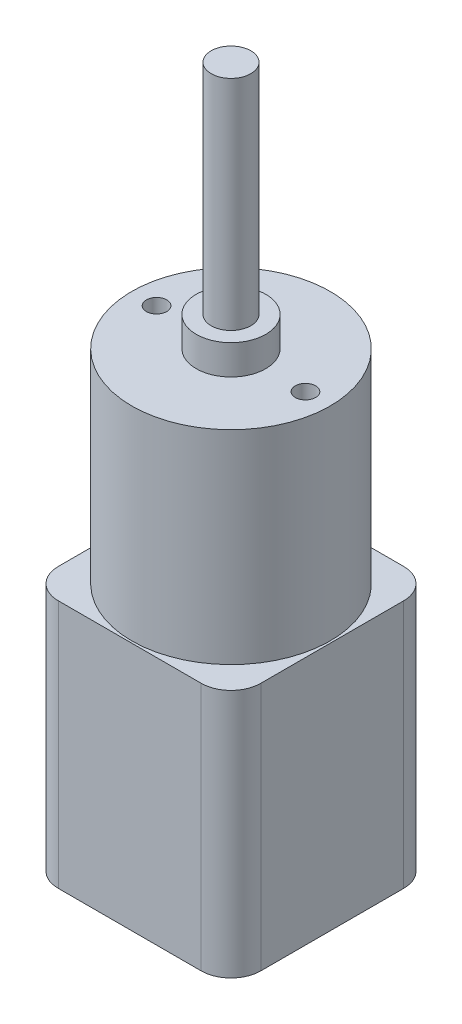
ISO-10303-21;
HEADER;
FILE_DESCRIPTION(('STEP AP214'),'2;1');
FILE_NAME('part.step','',(''),(''),'','','');
FILE_SCHEMA(('AUTOMOTIVE_DESIGN { 1 0 10303 214 1 1 1 1 }'));
ENDSEC;
DATA;
#1=APPLICATION_CONTEXT('core data for automotive mechanical design processes');
#2=APPLICATION_PROTOCOL_DEFINITION('international standard','automotive_design',2000,#1);
#3=PRODUCT_CONTEXT('',#1,'mechanical');
#4=PRODUCT('Part','Part','',(#3));
#5=PRODUCT_RELATED_PRODUCT_CATEGORY('part','',(#4));
#6=PRODUCT_DEFINITION_FORMATION('','',#4);
#7=PRODUCT_DEFINITION_CONTEXT('part definition',#1,'design');
#8=PRODUCT_DEFINITION('design','',#6,#7);
#9=PRODUCT_DEFINITION_SHAPE('','',#8);
#10=(LENGTH_UNIT() NAMED_UNIT(*) SI_UNIT(.MILLI.,.METRE.));
#11=(NAMED_UNIT(*) PLANE_ANGLE_UNIT() SI_UNIT($,.RADIAN.));
#12=(NAMED_UNIT(*) SI_UNIT($,.STERADIAN.) SOLID_ANGLE_UNIT());
#13=UNCERTAINTY_MEASURE_WITH_UNIT(LENGTH_MEASURE(1.E-05),#10,'distance_accuracy_value','');
#14=(GEOMETRIC_REPRESENTATION_CONTEXT(3) GLOBAL_UNCERTAINTY_ASSIGNED_CONTEXT((#13)) GLOBAL_UNIT_ASSIGNED_CONTEXT((#10,
#11,#12)) REPRESENTATION_CONTEXT('',''));
#15=CARTESIAN_POINT('',(0.,0.,0.));
#16=DIRECTION('',(0.,0.,1.));
#17=DIRECTION('',(1.,0.,0.));
#18=AXIS2_PLACEMENT_3D('',#15,#16,#17);
#19=CARTESIAN_POINT('',(10.2,25.1,10.2));
#20=DIRECTION('',(-1.,0.,0.));
#21=DIRECTION('',(0.,0.,1.));
#22=AXIS2_PLACEMENT_3D('',#19,#20,#21);
#23=PLANE('',#22);
#24=DIRECTION('',(0.,0.,-1.));
#25=VECTOR('',#24,1.);
#26=CARTESIAN_POINT('',(10.2,25.1,10.2));
#27=LINE('',#26,#25);
#28=CARTESIAN_POINT('',(10.2,25.1,7.2));
#29=VERTEX_POINT('',#28);
#30=CARTESIAN_POINT('',(10.2,25.1,-7.2));
#31=VERTEX_POINT('',#30);
#32=EDGE_CURVE('E152',#29,#31,#27,.T.);
#33=ORIENTED_EDGE('',*,*,#32,.F.);
#34=DIRECTION('',(0.,-1.,0.));
#35=VECTOR('',#34,1.);
#36=CARTESIAN_POINT('',(10.2,25.1,7.2));
#37=LINE('',#36,#35);
#38=CARTESIAN_POINT('',(10.2,0.,7.2));
#39=VERTEX_POINT('',#38);
#40=EDGE_CURVE('E172',#29,#39,#37,.T.);
#41=ORIENTED_EDGE('',*,*,#40,.T.);
#42=DIRECTION('',(0.,0.,-1.));
#43=VECTOR('',#42,1.);
#44=CARTESIAN_POINT('',(10.2,0.,10.2));
#45=LINE('',#44,#43);
#46=CARTESIAN_POINT('',(10.2,0.,-7.2));
#47=VERTEX_POINT('',#46);
#48=EDGE_CURVE('E148',#39,#47,#45,.T.);
#49=ORIENTED_EDGE('',*,*,#48,.T.);
#50=DIRECTION('',(0.,-1.,0.));
#51=VECTOR('',#50,1.);
#52=CARTESIAN_POINT('',(10.2,25.1,-7.2));
#53=LINE('',#52,#51);
#54=EDGE_CURVE('E138',#47,#31,#53,.F.);
#55=ORIENTED_EDGE('',*,*,#54,.T.);
#56=EDGE_LOOP('',(#33,#41,#49,#55));
#57=FACE_BOUND('',#56,.T.);
#58=ADVANCED_FACE('F40',(#57),#23,.F.);
#59=CARTESIAN_POINT('',(-10.2,25.1,-10.2));
#60=DIRECTION('',(0.,0.,1.));
#61=DIRECTION('',(1.,0.,0.));
#62=AXIS2_PLACEMENT_3D('',#59,#60,#61);
#63=PLANE('',#62);
#64=DIRECTION('',(-1.,0.,0.));
#65=VECTOR('',#64,1.);
#66=CARTESIAN_POINT('',(-10.2,0.,-10.2));
#67=LINE('',#66,#65);
#68=CARTESIAN_POINT('',(7.2,0.,-10.2));
#69=VERTEX_POINT('',#68);
#70=CARTESIAN_POINT('',(-7.2,0.,-10.2));
#71=VERTEX_POINT('',#70);
#72=EDGE_CURVE('E164',#69,#71,#67,.T.);
#73=ORIENTED_EDGE('',*,*,#72,.T.);
#74=DIRECTION('',(0.,-1.,0.));
#75=VECTOR('',#74,1.);
#76=CARTESIAN_POINT('',(-7.2,25.1,-10.2));
#77=LINE('',#76,#75);
#78=CARTESIAN_POINT('',(-7.2,25.1,-10.2));
#79=VERTEX_POINT('',#78);
#80=EDGE_CURVE('E11',#71,#79,#77,.F.);
#81=ORIENTED_EDGE('',*,*,#80,.T.);
#82=DIRECTION('',(-1.,0.,0.));
#83=VECTOR('',#82,1.);
#84=CARTESIAN_POINT('',(-10.2,25.1,-10.2));
#85=LINE('',#84,#83);
#86=CARTESIAN_POINT('',(7.2,25.1,-10.2));
#87=VERTEX_POINT('',#86);
#88=EDGE_CURVE('E155',#87,#79,#85,.T.);
#89=ORIENTED_EDGE('',*,*,#88,.F.);
#90=DIRECTION('',(0.,-1.,0.));
#91=VECTOR('',#90,1.);
#92=CARTESIAN_POINT('',(7.2,25.1,-10.2));
#93=LINE('',#92,#91);
#94=EDGE_CURVE('E48',#87,#69,#93,.T.);
#95=ORIENTED_EDGE('',*,*,#94,.T.);
#96=EDGE_LOOP('',(#73,#81,#89,#95));
#97=FACE_BOUND('',#96,.T.);
#98=ADVANCED_FACE('F203',(#97),#63,.F.);
#99=CARTESIAN_POINT('',(-10.2,25.1,10.2));
#100=DIRECTION('',(1.,0.,0.));
#101=DIRECTION('',(0.,0.,-1.));
#102=AXIS2_PLACEMENT_3D('',#99,#100,#101);
#103=PLANE('',#102);
#104=DIRECTION('',(0.,0.,1.));
#105=VECTOR('',#104,1.);
#106=CARTESIAN_POINT('',(-10.2,0.,10.2));
#107=LINE('',#106,#105);
#108=CARTESIAN_POINT('',(-10.2,0.,-7.2));
#109=VERTEX_POINT('',#108);
#110=CARTESIAN_POINT('',(-10.2,0.,7.2));
#111=VERTEX_POINT('',#110);
#112=EDGE_CURVE('E167',#109,#111,#107,.T.);
#113=ORIENTED_EDGE('',*,*,#112,.T.);
#114=DIRECTION('',(0.,-1.,0.));
#115=VECTOR('',#114,1.);
#116=CARTESIAN_POINT('',(-10.2,25.1,7.2));
#117=LINE('',#116,#115);
#118=CARTESIAN_POINT('',(-10.2,25.1,7.2));
#119=VERTEX_POINT('',#118);
#120=EDGE_CURVE('E55',#111,#119,#117,.F.);
#121=ORIENTED_EDGE('',*,*,#120,.T.);
#122=DIRECTION('',(0.,0.,1.));
#123=VECTOR('',#122,1.);
#124=CARTESIAN_POINT('',(-10.2,25.1,10.2));
#125=LINE('',#124,#123);
#126=CARTESIAN_POINT('',(-10.2,25.1,-7.2));
#127=VERTEX_POINT('',#126);
#128=EDGE_CURVE('E158',#127,#119,#125,.T.);
#129=ORIENTED_EDGE('',*,*,#128,.F.);
#130=DIRECTION('',(0.,-1.,0.));
#131=VECTOR('',#130,1.);
#132=CARTESIAN_POINT('',(-10.2,25.1,-7.2));
#133=LINE('',#132,#131);
#134=EDGE_CURVE('E195',#127,#109,#133,.T.);
#135=ORIENTED_EDGE('',*,*,#134,.T.);
#136=EDGE_LOOP('',(#113,#121,#129,#135));
#137=FACE_BOUND('',#136,.T.);
#138=ADVANCED_FACE('F214',(#137),#103,.F.);
#139=CARTESIAN_POINT('',(-10.2,25.1,10.2));
#140=DIRECTION('',(0.,0.,-1.));
#141=DIRECTION('',(-1.,0.,0.));
#142=AXIS2_PLACEMENT_3D('',#139,#140,#141);
#143=PLANE('',#142);
#144=DIRECTION('',(1.,0.,0.));
#145=VECTOR('',#144,1.);
#146=CARTESIAN_POINT('',(-10.2,0.,10.2));
#147=LINE('',#146,#145);
#148=CARTESIAN_POINT('',(-7.2,0.,10.2));
#149=VERTEX_POINT('',#148);
#150=CARTESIAN_POINT('',(7.2,0.,10.2));
#151=VERTEX_POINT('',#150);
#152=EDGE_CURVE('E156',#149,#151,#147,.T.);
#153=ORIENTED_EDGE('',*,*,#152,.T.);
#154=DIRECTION('',(0.,-1.,0.));
#155=VECTOR('',#154,1.);
#156=CARTESIAN_POINT('',(7.2,25.1,10.2));
#157=LINE('',#156,#155);
#158=CARTESIAN_POINT('',(7.2,25.1,10.2));
#159=VERTEX_POINT('',#158);
#160=EDGE_CURVE('E186',#151,#159,#157,.F.);
#161=ORIENTED_EDGE('',*,*,#160,.T.);
#162=DIRECTION('',(1.,0.,0.));
#163=VECTOR('',#162,1.);
#164=CARTESIAN_POINT('',(-10.2,25.1,10.2));
#165=LINE('',#164,#163);
#166=CARTESIAN_POINT('',(-7.2,25.1,10.2));
#167=VERTEX_POINT('',#166);
#168=EDGE_CURVE('E151',#167,#159,#165,.T.);
#169=ORIENTED_EDGE('',*,*,#168,.F.);
#170=DIRECTION('',(0.,-1.,0.));
#171=VECTOR('',#170,1.);
#172=CARTESIAN_POINT('',(-7.2,25.1,10.2));
#173=LINE('',#172,#171);
#174=EDGE_CURVE('E183',#167,#149,#173,.T.);
#175=ORIENTED_EDGE('',*,*,#174,.T.);
#176=EDGE_LOOP('',(#153,#161,#169,#175));
#177=FACE_BOUND('',#176,.T.);
#178=ADVANCED_FACE('F223',(#177),#143,.F.);
#179=CARTESIAN_POINT('',(0.,25.1,0.));
#180=DIRECTION('',(0.,-1.,0.));
#181=DIRECTION('',(0.,0.,-1.));
#182=AXIS2_PLACEMENT_3D('',#179,#180,#181);
#183=PLANE('',#182);
#184=CARTESIAN_POINT('',(0.,25.1,0.));
#185=DIRECTION('',(0.,1.,0.));
#186=DIRECTION('',(0.,0.,1.));
#187=AXIS2_PLACEMENT_3D('',#184,#185,#186);
#188=CIRCLE('',#187,10.);
#189=CARTESIAN_POINT('',(0.,25.1,10.));
#190=VERTEX_POINT('',#189);
#191=EDGE_CURVE('E145',#190,#190,#188,.T.);
#192=ORIENTED_EDGE('',*,*,#191,.F.);
#193=EDGE_LOOP('',(#192));
#194=FACE_BOUND('',#193,.T.);
#195=ORIENTED_EDGE('',*,*,#168,.T.);
#196=CARTESIAN_POINT('',(7.2,25.1,7.2));
#197=DIRECTION('',(0.,-1.,0.));
#198=DIRECTION('',(0.,0.,-1.));
#199=AXIS2_PLACEMENT_3D('',#196,#197,#198);
#200=CIRCLE('',#199,3.);
#201=EDGE_CURVE('E193',#159,#29,#200,.F.);
#202=ORIENTED_EDGE('',*,*,#201,.T.);
#203=ORIENTED_EDGE('',*,*,#32,.T.);
#204=CARTESIAN_POINT('',(7.2,25.1,-7.2));
#205=DIRECTION('',(0.,-1.,0.));
#206=DIRECTION('',(0.,0.,-1.));
#207=AXIS2_PLACEMENT_3D('',#204,#205,#206);
#208=CIRCLE('',#207,3.);
#209=EDGE_CURVE('E188',#31,#87,#208,.F.);
#210=ORIENTED_EDGE('',*,*,#209,.T.);
#211=ORIENTED_EDGE('',*,*,#88,.T.);
#212=CARTESIAN_POINT('',(-7.2,25.1,-7.2));
#213=DIRECTION('',(0.,-1.,0.));
#214=DIRECTION('',(0.,0.,-1.));
#215=AXIS2_PLACEMENT_3D('',#212,#213,#214);
#216=CIRCLE('',#215,3.);
#217=EDGE_CURVE('E62',#79,#127,#216,.F.);
#218=ORIENTED_EDGE('',*,*,#217,.T.);
#219=ORIENTED_EDGE('',*,*,#128,.T.);
#220=CARTESIAN_POINT('',(-7.2,25.1,7.2));
#221=DIRECTION('',(0.,-1.,0.));
#222=DIRECTION('',(0.,0.,-1.));
#223=AXIS2_PLACEMENT_3D('',#220,#221,#222);
#224=CIRCLE('',#223,3.);
#225=EDGE_CURVE('E191',#119,#167,#224,.F.);
#226=ORIENTED_EDGE('',*,*,#225,.T.);
#227=EDGE_LOOP('',(#195,#202,#203,#210,#211,#218,#219,#226));
#228=FACE_BOUND('',#227,.T.);
#229=ADVANCED_FACE('F216',(#194,#228),#183,.F.);
#230=CARTESIAN_POINT('',(0.,0.,0.));
#231=DIRECTION('',(0.,-1.,0.));
#232=DIRECTION('',(0.,0.,-1.));
#233=AXIS2_PLACEMENT_3D('',#230,#231,#232);
#234=PLANE('',#233);
#235=ORIENTED_EDGE('',*,*,#48,.F.);
#236=CARTESIAN_POINT('',(7.2,0.,7.2));
#237=DIRECTION('',(0.,-1.,0.));
#238=DIRECTION('',(0.,0.,-1.));
#239=AXIS2_PLACEMENT_3D('',#236,#237,#238);
#240=CIRCLE('',#239,3.);
#241=EDGE_CURVE('E181',#39,#151,#240,.T.);
#242=ORIENTED_EDGE('',*,*,#241,.T.);
#243=ORIENTED_EDGE('',*,*,#152,.F.);
#244=CARTESIAN_POINT('',(-7.2,0.,7.2));
#245=DIRECTION('',(0.,-1.,0.));
#246=DIRECTION('',(0.,0.,-1.));
#247=AXIS2_PLACEMENT_3D('',#244,#245,#246);
#248=CIRCLE('',#247,3.);
#249=EDGE_CURVE('E179',#149,#111,#248,.T.);
#250=ORIENTED_EDGE('',*,*,#249,.T.);
#251=ORIENTED_EDGE('',*,*,#112,.F.);
#252=CARTESIAN_POINT('',(-7.2,0.,-7.2));
#253=DIRECTION('',(0.,-1.,0.));
#254=DIRECTION('',(0.,0.,-1.));
#255=AXIS2_PLACEMENT_3D('',#252,#253,#254);
#256=CIRCLE('',#255,3.);
#257=EDGE_CURVE('E177',#109,#71,#256,.T.);
#258=ORIENTED_EDGE('',*,*,#257,.T.);
#259=ORIENTED_EDGE('',*,*,#72,.F.);
#260=CARTESIAN_POINT('',(7.2,0.,-7.2));
#261=DIRECTION('',(0.,-1.,0.));
#262=DIRECTION('',(0.,0.,-1.));
#263=AXIS2_PLACEMENT_3D('',#260,#261,#262);
#264=CIRCLE('',#263,3.);
#265=EDGE_CURVE('E175',#69,#47,#264,.T.);
#266=ORIENTED_EDGE('',*,*,#265,.T.);
#267=EDGE_LOOP('',(#235,#242,#243,#250,#251,#258,#259,#266));
#268=FACE_BOUND('',#267,.T.);
#269=ADVANCED_FACE('F209',(#268),#234,.T.);
#270=CARTESIAN_POINT('',(0.,45.6,0.));
#271=DIRECTION('',(0.,-1.,0.));
#272=DIRECTION('',(0.,0.,-1.));
#273=AXIS2_PLACEMENT_3D('',#270,#271,#272);
#274=CYLINDRICAL_SURFACE('',#273,10.);
#275=CARTESIAN_POINT('',(0.,45.6,0.));
#276=DIRECTION('',(0.,1.,0.));
#277=DIRECTION('',(0.,0.,1.));
#278=AXIS2_PLACEMENT_3D('',#275,#276,#277);
#279=CIRCLE('',#278,10.);
#280=CARTESIAN_POINT('',(0.,45.6,10.));
#281=VERTEX_POINT('',#280);
#282=EDGE_CURVE('E142',#281,#281,#279,.T.);
#283=ORIENTED_EDGE('',*,*,#282,.F.);
#284=EDGE_LOOP('',(#283));
#285=FACE_BOUND('',#284,.T.);
#286=ORIENTED_EDGE('',*,*,#191,.T.);
#287=EDGE_LOOP('',(#286));
#288=FACE_BOUND('',#287,.T.);
#289=ADVANCED_FACE('F346',(#285,#288),#274,.T.);
#290=CARTESIAN_POINT('',(0.,45.6,0.));
#291=DIRECTION('',(0.,1.,0.));
#292=DIRECTION('',(0.,0.,1.));
#293=AXIS2_PLACEMENT_3D('',#290,#291,#292);
#294=PLANE('',#293);
#295=CARTESIAN_POINT('',(-7.5,45.6,0.));
#296=DIRECTION('',(0.,1.,0.));
#297=DIRECTION('',(0.,0.,1.));
#298=AXIS2_PLACEMENT_3D('',#295,#296,#297);
#299=CIRCLE('',#298,1.025);
#300=CARTESIAN_POINT('',(-7.5,45.6,1.025));
#301=VERTEX_POINT('',#300);
#302=EDGE_CURVE('E121',#301,#301,#299,.T.);
#303=ORIENTED_EDGE('',*,*,#302,.F.);
#304=EDGE_LOOP('',(#303));
#305=FACE_BOUND('',#304,.T.);
#306=CARTESIAN_POINT('',(7.5,45.6,0.));
#307=DIRECTION('',(0.,1.,0.));
#308=DIRECTION('',(0.,0.,1.));
#309=AXIS2_PLACEMENT_3D('',#306,#307,#308);
#310=CIRCLE('',#309,1.025);
#311=CARTESIAN_POINT('',(7.5,45.6,1.025));
#312=VERTEX_POINT('',#311);
#313=EDGE_CURVE('E120',#312,#312,#310,.T.);
#314=ORIENTED_EDGE('',*,*,#313,.F.);
#315=EDGE_LOOP('',(#314));
#316=FACE_BOUND('',#315,.T.);
#317=CARTESIAN_POINT('',(0.,45.6,0.));
#318=DIRECTION('',(0.,1.,0.));
#319=DIRECTION('',(0.,0.,1.));
#320=AXIS2_PLACEMENT_3D('',#317,#318,#319);
#321=CIRCLE('',#320,3.5);
#322=CARTESIAN_POINT('',(0.,45.6,3.5));
#323=VERTEX_POINT('',#322);
#324=EDGE_CURVE('E139',#323,#323,#321,.T.);
#325=ORIENTED_EDGE('',*,*,#324,.F.);
#326=EDGE_LOOP('',(#325));
#327=FACE_BOUND('',#326,.T.);
#328=ORIENTED_EDGE('',*,*,#282,.T.);
#329=EDGE_LOOP('',(#328));
#330=FACE_BOUND('',#329,.T.);
#331=ADVANCED_FACE('F336',(#305,#316,#327,#330),#294,.T.);
#332=CARTESIAN_POINT('',(0.,48.6,0.));
#333=DIRECTION('',(0.,-1.,0.));
#334=DIRECTION('',(0.,0.,-1.));
#335=AXIS2_PLACEMENT_3D('',#332,#333,#334);
#336=CYLINDRICAL_SURFACE('',#335,3.5);
#337=CARTESIAN_POINT('',(0.,48.6,0.));
#338=DIRECTION('',(0.,1.,0.));
#339=DIRECTION('',(0.,0.,1.));
#340=AXIS2_PLACEMENT_3D('',#337,#338,#339);
#341=CIRCLE('',#340,3.5);
#342=CARTESIAN_POINT('',(0.,48.6,3.5));
#343=VERTEX_POINT('',#342);
#344=EDGE_CURVE('E134',#343,#343,#341,.T.);
#345=ORIENTED_EDGE('',*,*,#344,.F.);
#346=EDGE_LOOP('',(#345));
#347=FACE_BOUND('',#346,.T.);
#348=ORIENTED_EDGE('',*,*,#324,.T.);
#349=EDGE_LOOP('',(#348));
#350=FACE_BOUND('',#349,.T.);
#351=ADVANCED_FACE('F327',(#347,#350),#336,.T.);
#352=CARTESIAN_POINT('',(0.,48.6,0.));
#353=DIRECTION('',(0.,1.,0.));
#354=DIRECTION('',(0.,0.,1.));
#355=AXIS2_PLACEMENT_3D('',#352,#353,#354);
#356=PLANE('',#355);
#357=CARTESIAN_POINT('',(0.,48.6,0.));
#358=DIRECTION('',(0.,1.,0.));
#359=DIRECTION('',(0.,0.,1.));
#360=AXIS2_PLACEMENT_3D('',#357,#358,#359);
#361=CIRCLE('',#360,2.);
#362=CARTESIAN_POINT('',(0.,48.6,2.));
#363=VERTEX_POINT('',#362);
#364=EDGE_CURVE('E135',#363,#363,#361,.T.);
#365=ORIENTED_EDGE('',*,*,#364,.F.);
#366=EDGE_LOOP('',(#365));
#367=FACE_BOUND('',#366,.T.);
#368=ORIENTED_EDGE('',*,*,#344,.T.);
#369=EDGE_LOOP('',(#368));
#370=FACE_BOUND('',#369,.T.);
#371=ADVANCED_FACE('F318',(#367,#370),#356,.T.);
#372=CARTESIAN_POINT('',(0.,70.6,0.));
#373=DIRECTION('',(0.,-1.,0.));
#374=DIRECTION('',(0.,0.,-1.));
#375=AXIS2_PLACEMENT_3D('',#372,#373,#374);
#376=CYLINDRICAL_SURFACE('',#375,2.);
#377=CARTESIAN_POINT('',(0.,70.6,0.));
#378=DIRECTION('',(0.,1.,0.));
#379=DIRECTION('',(0.,0.,1.));
#380=AXIS2_PLACEMENT_3D('',#377,#378,#379);
#381=CIRCLE('',#380,2.);
#382=CARTESIAN_POINT('',(0.,70.6,2.));
#383=VERTEX_POINT('',#382);
#384=EDGE_CURVE('E131',#383,#383,#381,.T.);
#385=ORIENTED_EDGE('',*,*,#384,.F.);
#386=EDGE_LOOP('',(#385));
#387=FACE_BOUND('',#386,.T.);
#388=ORIENTED_EDGE('',*,*,#364,.T.);
#389=EDGE_LOOP('',(#388));
#390=FACE_BOUND('',#389,.T.);
#391=ADVANCED_FACE('F309',(#387,#390),#376,.T.);
#392=CARTESIAN_POINT('',(0.,70.6,0.));
#393=DIRECTION('',(0.,1.,0.));
#394=DIRECTION('',(0.,0.,1.));
#395=AXIS2_PLACEMENT_3D('',#392,#393,#394);
#396=PLANE('',#395);
#397=ORIENTED_EDGE('',*,*,#384,.T.);
#398=EDGE_LOOP('',(#397));
#399=FACE_BOUND('',#398,.T.);
#400=ADVANCED_FACE('F299',(#399),#396,.T.);
#401=CARTESIAN_POINT('',(7.5,40.6,0.));
#402=DIRECTION('',(0.,1.,0.));
#403=DIRECTION('',(0.,0.,1.));
#404=AXIS2_PLACEMENT_3D('',#401,#402,#403);
#405=CONICAL_SURFACE('',#404,1.025,1.02974425867665);
#406=CARTESIAN_POINT('',(7.5,39.9841178654967,0.));
#407=VERTEX_POINT('',#406);
#408=VERTEX_LOOP('',#407);
#409=FACE_BOUND('',#408,.T.);
#410=CARTESIAN_POINT('',(7.5,40.6,0.));
#411=DIRECTION('',(0.,1.,0.));
#412=DIRECTION('',(0.,0.,1.));
#413=AXIS2_PLACEMENT_3D('',#410,#411,#412);
#414=CIRCLE('',#413,1.025);
#415=CARTESIAN_POINT('',(7.5,40.6,1.025));
#416=VERTEX_POINT('',#415);
#417=EDGE_CURVE('E124',#416,#416,#414,.T.);
#418=ORIENTED_EDGE('',*,*,#417,.T.);
#419=EDGE_LOOP('',(#418));
#420=FACE_BOUND('',#419,.T.);
#421=ADVANCED_FACE('F289',(#409,#420),#405,.F.);
#422=CARTESIAN_POINT('',(7.5,45.6,0.));
#423=DIRECTION('',(0.,1.,0.));
#424=DIRECTION('',(0.,0.,1.));
#425=AXIS2_PLACEMENT_3D('',#422,#423,#424);
#426=CYLINDRICAL_SURFACE('',#425,1.025);
#427=ORIENTED_EDGE('',*,*,#417,.F.);
#428=EDGE_LOOP('',(#427));
#429=FACE_BOUND('',#428,.T.);
#430=ORIENTED_EDGE('',*,*,#313,.T.);
#431=EDGE_LOOP('',(#430));
#432=FACE_BOUND('',#431,.T.);
#433=ADVANCED_FACE('F114',(#429,#432),#426,.F.);
#434=CARTESIAN_POINT('',(-7.5,40.6,0.));
#435=DIRECTION('',(0.,1.,0.));
#436=DIRECTION('',(0.,0.,1.));
#437=AXIS2_PLACEMENT_3D('',#434,#435,#436);
#438=CONICAL_SURFACE('',#437,1.025,1.02974425867665);
#439=CARTESIAN_POINT('',(-7.5,39.9841178654967,0.));
#440=VERTEX_POINT('',#439);
#441=VERTEX_LOOP('',#440);
#442=FACE_BOUND('',#441,.T.);
#443=CARTESIAN_POINT('',(-7.5,40.6,0.));
#444=DIRECTION('',(0.,1.,0.));
#445=DIRECTION('',(0.,0.,1.));
#446=AXIS2_PLACEMENT_3D('',#443,#444,#445);
#447=CIRCLE('',#446,1.025);
#448=CARTESIAN_POINT('',(-7.5,40.6,1.025));
#449=VERTEX_POINT('',#448);
#450=EDGE_CURVE('E118',#449,#449,#447,.T.);
#451=ORIENTED_EDGE('',*,*,#450,.T.);
#452=EDGE_LOOP('',(#451));
#453=FACE_BOUND('',#452,.T.);
#454=ADVANCED_FACE('F110',(#442,#453),#438,.F.);
#455=CARTESIAN_POINT('',(-7.5,45.6,0.));
#456=DIRECTION('',(0.,1.,0.));
#457=DIRECTION('',(0.,0.,1.));
#458=AXIS2_PLACEMENT_3D('',#455,#456,#457);
#459=CYLINDRICAL_SURFACE('',#458,1.025);
#460=ORIENTED_EDGE('',*,*,#450,.F.);
#461=EDGE_LOOP('',(#460));
#462=FACE_BOUND('',#461,.T.);
#463=ORIENTED_EDGE('',*,*,#302,.T.);
#464=EDGE_LOOP('',(#463));
#465=FACE_BOUND('',#464,.T.);
#466=ADVANCED_FACE('F113',(#462,#465),#459,.F.);
#467=CARTESIAN_POINT('',(7.2,25.1,7.2));
#468=DIRECTION('',(0.,-1.,0.));
#469=DIRECTION('',(0.,0.,-1.));
#470=AXIS2_PLACEMENT_3D('',#467,#468,#469);
#471=CYLINDRICAL_SURFACE('',#470,3.);
#472=ORIENTED_EDGE('',*,*,#201,.F.);
#473=ORIENTED_EDGE('',*,*,#160,.F.);
#474=ORIENTED_EDGE('',*,*,#241,.F.);
#475=ORIENTED_EDGE('',*,*,#40,.F.);
#476=EDGE_LOOP('',(#472,#473,#474,#475));
#477=FACE_BOUND('',#476,.T.);
#478=ADVANCED_FACE('F228',(#477),#471,.T.);
#479=CARTESIAN_POINT('',(-7.2,25.1,7.2));
#480=DIRECTION('',(0.,-1.,0.));
#481=DIRECTION('',(0.,0.,-1.));
#482=AXIS2_PLACEMENT_3D('',#479,#480,#481);
#483=CYLINDRICAL_SURFACE('',#482,3.);
#484=ORIENTED_EDGE('',*,*,#225,.F.);
#485=ORIENTED_EDGE('',*,*,#120,.F.);
#486=ORIENTED_EDGE('',*,*,#249,.F.);
#487=ORIENTED_EDGE('',*,*,#174,.F.);
#488=EDGE_LOOP('',(#484,#485,#486,#487));
#489=FACE_BOUND('',#488,.T.);
#490=ADVANCED_FACE('F220',(#489),#483,.T.);
#491=CARTESIAN_POINT('',(-7.2,25.1,-7.2));
#492=DIRECTION('',(0.,-1.,0.));
#493=DIRECTION('',(0.,0.,-1.));
#494=AXIS2_PLACEMENT_3D('',#491,#492,#493);
#495=CYLINDRICAL_SURFACE('',#494,3.);
#496=ORIENTED_EDGE('',*,*,#217,.F.);
#497=ORIENTED_EDGE('',*,*,#80,.F.);
#498=ORIENTED_EDGE('',*,*,#257,.F.);
#499=ORIENTED_EDGE('',*,*,#134,.F.);
#500=EDGE_LOOP('',(#496,#497,#498,#499));
#501=FACE_BOUND('',#500,.T.);
#502=ADVANCED_FACE('F213',(#501),#495,.T.);
#503=CARTESIAN_POINT('',(7.2,25.1,-7.2));
#504=DIRECTION('',(0.,-1.,0.));
#505=DIRECTION('',(0.,0.,-1.));
#506=AXIS2_PLACEMENT_3D('',#503,#504,#505);
#507=CYLINDRICAL_SURFACE('',#506,3.);
#508=ORIENTED_EDGE('',*,*,#209,.F.);
#509=ORIENTED_EDGE('',*,*,#54,.F.);
#510=ORIENTED_EDGE('',*,*,#265,.F.);
#511=ORIENTED_EDGE('',*,*,#94,.F.);
#512=EDGE_LOOP('',(#508,#509,#510,#511));
#513=FACE_BOUND('',#512,.T.);
#514=ADVANCED_FACE('F42',(#513),#507,.T.);
#515=CLOSED_SHELL('',(#58,#98,#138,#178,#229,#269,#289,#331,#351,#371,#391,#400,#421,#433,#454,
#466,#478,#490,#502,#514));
#516=MANIFOLD_SOLID_BREP('B2',#515);
#517=ADVANCED_BREP_SHAPE_REPRESENTATION('',(#18,#516),#14);
#518=SHAPE_DEFINITION_REPRESENTATION(#9,#517);
ENDSEC;
END-ISO-10303-21;
